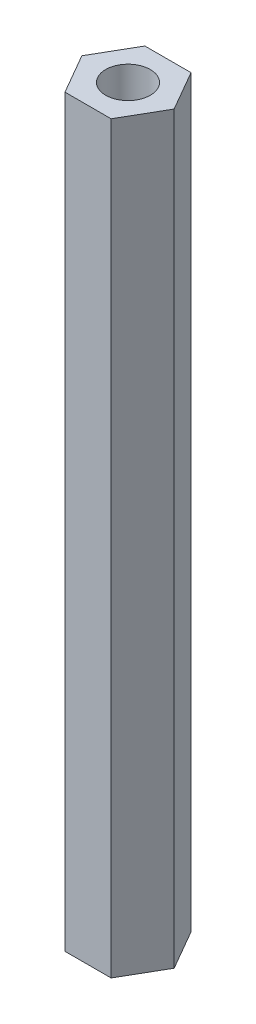
ISO-10303-21;
HEADER;
FILE_DESCRIPTION(('STEP AP214'),'2;1');
FILE_NAME('part.step','',(''),(''),'','','');
FILE_SCHEMA(('AUTOMOTIVE_DESIGN { 1 0 10303 214 1 1 1 1 }'));
ENDSEC;
DATA;
#1=APPLICATION_CONTEXT('core data for automotive mechanical design processes');
#2=APPLICATION_PROTOCOL_DEFINITION('international standard','automotive_design',2000,#1);
#3=PRODUCT_CONTEXT('',#1,'mechanical');
#4=PRODUCT('Part','Part','',(#3));
#5=PRODUCT_RELATED_PRODUCT_CATEGORY('part','',(#4));
#6=PRODUCT_DEFINITION_FORMATION('','',#4);
#7=PRODUCT_DEFINITION_CONTEXT('part definition',#1,'design');
#8=PRODUCT_DEFINITION('design','',#6,#7);
#9=PRODUCT_DEFINITION_SHAPE('','',#8);
#10=(LENGTH_UNIT() NAMED_UNIT(*) SI_UNIT(.MILLI.,.METRE.));
#11=(NAMED_UNIT(*) PLANE_ANGLE_UNIT() SI_UNIT($,.RADIAN.));
#12=(NAMED_UNIT(*) SI_UNIT($,.STERADIAN.) SOLID_ANGLE_UNIT());
#13=UNCERTAINTY_MEASURE_WITH_UNIT(LENGTH_MEASURE(1.E-05),#10,'distance_accuracy_value','');
#14=(GEOMETRIC_REPRESENTATION_CONTEXT(3) GLOBAL_UNCERTAINTY_ASSIGNED_CONTEXT((#13)) GLOBAL_UNIT_ASSIGNED_CONTEXT((#10,
#11,#12)) REPRESENTATION_CONTEXT('',''));
#15=CARTESIAN_POINT('',(0.,0.,0.));
#16=DIRECTION('',(0.,0.,1.));
#17=DIRECTION('',(1.,0.,0.));
#18=AXIS2_PLACEMENT_3D('',#15,#16,#17);
#19=CARTESIAN_POINT('',(1.55000000000003,50.,2.68467875173174));
#20=DIRECTION('',(-0.866025403784441,0.,-0.499999999999995));
#21=DIRECTION('',(-0.499999999999995,0.,0.866025403784441));
#22=AXIS2_PLACEMENT_3D('',#19,#20,#21);
#23=PLANE('',#22);
#24=DIRECTION('',(0.499999999999995,0.,-0.866025403784441));
#25=VECTOR('',#24,1.);
#26=CARTESIAN_POINT('',(1.55000000000003,0.,2.68467875173174));
#27=LINE('',#26,#25);
#28=CARTESIAN_POINT('',(1.55000000000003,0.,2.68467875173174));
#29=VERTEX_POINT('',#28);
#30=CARTESIAN_POINT('',(3.1,0.,0.));
#31=VERTEX_POINT('',#30);
#32=EDGE_CURVE('E139',#29,#31,#27,.T.);
#33=ORIENTED_EDGE('',*,*,#32,.T.);
#34=DIRECTION('',(0.,-1.,0.));
#35=VECTOR('',#34,1.);
#36=CARTESIAN_POINT('',(3.1,50.,0.));
#37=LINE('',#36,#35);
#38=CARTESIAN_POINT('',(3.1,50.,0.));
#39=VERTEX_POINT('',#38);
#40=EDGE_CURVE('E11',#39,#31,#37,.T.);
#41=ORIENTED_EDGE('',*,*,#40,.F.);
#42=DIRECTION('',(0.499999999999995,0.,-0.866025403784441));
#43=VECTOR('',#42,1.);
#44=CARTESIAN_POINT('',(1.55000000000003,50.,2.68467875173174));
#45=LINE('',#44,#43);
#46=CARTESIAN_POINT('',(1.55000000000003,50.,2.68467875173174));
#47=VERTEX_POINT('',#46);
#48=EDGE_CURVE('E156',#47,#39,#45,.T.);
#49=ORIENTED_EDGE('',*,*,#48,.F.);
#50=DIRECTION('',(0.,-1.,0.));
#51=VECTOR('',#50,1.);
#52=CARTESIAN_POINT('',(1.55000000000003,50.,2.68467875173174));
#53=LINE('',#52,#51);
#54=EDGE_CURVE('E135',#47,#29,#53,.T.);
#55=ORIENTED_EDGE('',*,*,#54,.T.);
#56=EDGE_LOOP('',(#33,#41,#49,#55));
#57=FACE_BOUND('',#56,.T.);
#58=ADVANCED_FACE('F49',(#57),#23,.F.);
#59=CARTESIAN_POINT('',(3.1,50.,0.));
#60=DIRECTION('',(-0.866025403784438,0.,0.500000000000001));
#61=DIRECTION('',(0.500000000000001,0.,0.866025403784438));
#62=AXIS2_PLACEMENT_3D('',#59,#60,#61);
#63=PLANE('',#62);
#64=DIRECTION('',(-0.500000000000001,0.,-0.866025403784438));
#65=VECTOR('',#64,1.);
#66=CARTESIAN_POINT('',(3.1,0.,0.));
#67=LINE('',#66,#65);
#68=CARTESIAN_POINT('',(1.54999999999999,0.,-2.68467875173176));
#69=VERTEX_POINT('',#68);
#70=EDGE_CURVE('E143',#31,#69,#67,.T.);
#71=ORIENTED_EDGE('',*,*,#70,.T.);
#72=DIRECTION('',(0.,-1.,0.));
#73=VECTOR('',#72,1.);
#74=CARTESIAN_POINT('',(1.54999999999999,50.,-2.68467875173176));
#75=LINE('',#74,#73);
#76=CARTESIAN_POINT('',(1.54999999999999,50.,-2.68467875173176));
#77=VERTEX_POINT('',#76);
#78=EDGE_CURVE('E58',#77,#69,#75,.T.);
#79=ORIENTED_EDGE('',*,*,#78,.F.);
#80=DIRECTION('',(-0.500000000000001,0.,-0.866025403784438));
#81=VECTOR('',#80,1.);
#82=CARTESIAN_POINT('',(3.1,50.,0.));
#83=LINE('',#82,#81);
#84=EDGE_CURVE('E103',#39,#77,#83,.T.);
#85=ORIENTED_EDGE('',*,*,#84,.F.);
#86=ORIENTED_EDGE('',*,*,#40,.T.);
#87=EDGE_LOOP('',(#71,#79,#85,#86));
#88=FACE_BOUND('',#87,.T.);
#89=ADVANCED_FACE('F186',(#88),#63,.F.);
#90=CARTESIAN_POINT('',(1.54999999999999,50.,-2.68467875173176));
#91=DIRECTION('',(0.,0.,1.));
#92=DIRECTION('',(1.,0.,0.));
#93=AXIS2_PLACEMENT_3D('',#90,#91,#92);
#94=PLANE('',#93);
#95=DIRECTION('',(-1.,0.,0.));
#96=VECTOR('',#95,1.);
#97=CARTESIAN_POINT('',(1.54999999999999,0.,-2.68467875173176));
#98=LINE('',#97,#96);
#99=CARTESIAN_POINT('',(-1.55000000000001,0.,-2.68467875173175));
#100=VERTEX_POINT('',#99);
#101=EDGE_CURVE('E147',#69,#100,#98,.T.);
#102=ORIENTED_EDGE('',*,*,#101,.T.);
#103=DIRECTION('',(0.,-1.,0.));
#104=VECTOR('',#103,1.);
#105=CARTESIAN_POINT('',(-1.55000000000001,50.,-2.68467875173175));
#106=LINE('',#105,#104);
#107=CARTESIAN_POINT('',(-1.55000000000001,50.,-2.68467875173175));
#108=VERTEX_POINT('',#107);
#109=EDGE_CURVE('E127',#108,#100,#106,.T.);
#110=ORIENTED_EDGE('',*,*,#109,.F.);
#111=DIRECTION('',(-1.,0.,0.));
#112=VECTOR('',#111,1.);
#113=CARTESIAN_POINT('',(1.54999999999999,50.,-2.68467875173176));
#114=LINE('',#113,#112);
#115=EDGE_CURVE('E116',#77,#108,#114,.T.);
#116=ORIENTED_EDGE('',*,*,#115,.F.);
#117=ORIENTED_EDGE('',*,*,#78,.T.);
#118=EDGE_LOOP('',(#102,#110,#116,#117));
#119=FACE_BOUND('',#118,.T.);
#120=ADVANCED_FACE('F167',(#119),#94,.F.);
#121=CARTESIAN_POINT('',(-1.55000000000001,50.,-2.68467875173175));
#122=DIRECTION('',(0.866025403784442,0.,0.499999999999995));
#123=DIRECTION('',(0.499999999999995,0.,-0.866025403784442));
#124=AXIS2_PLACEMENT_3D('',#121,#122,#123);
#125=PLANE('',#124);
#126=DIRECTION('',(-0.499999999999995,0.,0.866025403784442));
#127=VECTOR('',#126,1.);
#128=CARTESIAN_POINT('',(-1.55000000000001,0.,-2.68467875173175));
#129=LINE('',#128,#127);
#130=CARTESIAN_POINT('',(-3.1,0.,0.));
#131=VERTEX_POINT('',#130);
#132=EDGE_CURVE('E125',#100,#131,#129,.T.);
#133=ORIENTED_EDGE('',*,*,#132,.T.);
#134=DIRECTION('',(0.,-1.,0.));
#135=VECTOR('',#134,1.);
#136=CARTESIAN_POINT('',(-3.1,50.,0.));
#137=LINE('',#136,#135);
#138=CARTESIAN_POINT('',(-3.1,50.,0.));
#139=VERTEX_POINT('',#138);
#140=EDGE_CURVE('E122',#139,#131,#137,.T.);
#141=ORIENTED_EDGE('',*,*,#140,.F.);
#142=DIRECTION('',(-0.499999999999995,0.,0.866025403784442));
#143=VECTOR('',#142,1.);
#144=CARTESIAN_POINT('',(-1.55000000000001,50.,-2.68467875173175));
#145=LINE('',#144,#143);
#146=EDGE_CURVE('E110',#108,#139,#145,.T.);
#147=ORIENTED_EDGE('',*,*,#146,.F.);
#148=ORIENTED_EDGE('',*,*,#109,.T.);
#149=EDGE_LOOP('',(#133,#141,#147,#148));
#150=FACE_BOUND('',#149,.T.);
#151=ADVANCED_FACE('F123',(#150),#125,.F.);
#152=CARTESIAN_POINT('',(-3.1,50.,0.));
#153=DIRECTION('',(0.866025403784435,0.,-0.500000000000007));
#154=DIRECTION('',(-0.500000000000007,0.,-0.866025403784435));
#155=AXIS2_PLACEMENT_3D('',#152,#153,#154);
#156=PLANE('',#155);
#157=DIRECTION('',(0.500000000000007,0.,0.866025403784435));
#158=VECTOR('',#157,1.);
#159=CARTESIAN_POINT('',(-3.1,0.,0.));
#160=LINE('',#159,#158);
#161=CARTESIAN_POINT('',(-1.54999999999997,0.,2.68467875173177));
#162=VERTEX_POINT('',#161);
#163=EDGE_CURVE('E89',#131,#162,#160,.T.);
#164=ORIENTED_EDGE('',*,*,#163,.T.);
#165=DIRECTION('',(0.,-1.,0.));
#166=VECTOR('',#165,1.);
#167=CARTESIAN_POINT('',(-1.54999999999997,50.,2.68467875173177));
#168=LINE('',#167,#166);
#169=CARTESIAN_POINT('',(-1.54999999999997,50.,2.68467875173177));
#170=VERTEX_POINT('',#169);
#171=EDGE_CURVE('E128',#170,#162,#168,.T.);
#172=ORIENTED_EDGE('',*,*,#171,.F.);
#173=DIRECTION('',(0.500000000000007,0.,0.866025403784435));
#174=VECTOR('',#173,1.);
#175=CARTESIAN_POINT('',(-3.1,50.,0.));
#176=LINE('',#175,#174);
#177=EDGE_CURVE('E114',#139,#170,#176,.T.);
#178=ORIENTED_EDGE('',*,*,#177,.F.);
#179=ORIENTED_EDGE('',*,*,#140,.T.);
#180=EDGE_LOOP('',(#164,#172,#178,#179));
#181=FACE_BOUND('',#180,.T.);
#182=ADVANCED_FACE('F130',(#181),#156,.F.);
#183=CARTESIAN_POINT('',(-1.54999999999997,50.,2.68467875173177));
#184=DIRECTION('',(0.,0.,-1.));
#185=DIRECTION('',(-1.,0.,0.));
#186=AXIS2_PLACEMENT_3D('',#183,#184,#185);
#187=PLANE('',#186);
#188=DIRECTION('',(1.,0.,0.));
#189=VECTOR('',#188,1.);
#190=CARTESIAN_POINT('',(-1.54999999999997,0.,2.68467875173177));
#191=LINE('',#190,#189);
#192=EDGE_CURVE('E95',#162,#29,#191,.T.);
#193=ORIENTED_EDGE('',*,*,#192,.T.);
#194=ORIENTED_EDGE('',*,*,#54,.F.);
#195=DIRECTION('',(1.,0.,0.));
#196=VECTOR('',#195,1.);
#197=CARTESIAN_POINT('',(-1.54999999999997,50.,2.68467875173177));
#198=LINE('',#197,#196);
#199=EDGE_CURVE('E66',#170,#47,#198,.T.);
#200=ORIENTED_EDGE('',*,*,#199,.F.);
#201=ORIENTED_EDGE('',*,*,#171,.T.);
#202=EDGE_LOOP('',(#193,#194,#200,#201));
#203=FACE_BOUND('',#202,.T.);
#204=ADVANCED_FACE('F174',(#203),#187,.F.);
#205=CARTESIAN_POINT('',(0.,50.,0.));
#206=DIRECTION('',(0.,1.,0.));
#207=DIRECTION('',(0.,0.,1.));
#208=AXIS2_PLACEMENT_3D('',#205,#206,#207);
#209=PLANE('',#208);
#210=CARTESIAN_POINT('',(0.,50.,0.));
#211=DIRECTION('',(0.,1.,0.));
#212=DIRECTION('',(0.,0.,1.));
#213=AXIS2_PLACEMENT_3D('',#210,#211,#212);
#214=CIRCLE('',#213,1.5);
#215=CARTESIAN_POINT('',(0.,50.,1.5));
#216=VERTEX_POINT('',#215);
#217=EDGE_CURVE('E270',#216,#216,#214,.T.);
#218=ORIENTED_EDGE('',*,*,#217,.F.);
#219=EDGE_LOOP('',(#218));
#220=FACE_BOUND('',#219,.T.);
#221=ORIENTED_EDGE('',*,*,#48,.T.);
#222=ORIENTED_EDGE('',*,*,#84,.T.);
#223=ORIENTED_EDGE('',*,*,#115,.T.);
#224=ORIENTED_EDGE('',*,*,#146,.T.);
#225=ORIENTED_EDGE('',*,*,#177,.T.);
#226=ORIENTED_EDGE('',*,*,#199,.T.);
#227=EDGE_LOOP('',(#221,#222,#223,#224,#225,#226));
#228=FACE_BOUND('',#227,.T.);
#229=ADVANCED_FACE('F112',(#220,#228),#209,.T.);
#230=CARTESIAN_POINT('',(0.,0.,0.));
#231=DIRECTION('',(0.,1.,0.));
#232=DIRECTION('',(0.,0.,1.));
#233=AXIS2_PLACEMENT_3D('',#230,#231,#232);
#234=PLANE('',#233);
#235=CARTESIAN_POINT('',(0.,0.,0.));
#236=DIRECTION('',(0.,-1.,0.));
#237=DIRECTION('',(0.,0.,-1.));
#238=AXIS2_PLACEMENT_3D('',#235,#236,#237);
#239=CIRCLE('',#238,1.5);
#240=CARTESIAN_POINT('',(0.,0.,-1.5));
#241=VERTEX_POINT('',#240);
#242=EDGE_CURVE('E271',#241,#241,#239,.T.);
#243=ORIENTED_EDGE('',*,*,#242,.F.);
#244=EDGE_LOOP('',(#243));
#245=FACE_BOUND('',#244,.T.);
#246=ORIENTED_EDGE('',*,*,#32,.F.);
#247=ORIENTED_EDGE('',*,*,#192,.F.);
#248=ORIENTED_EDGE('',*,*,#163,.F.);
#249=ORIENTED_EDGE('',*,*,#132,.F.);
#250=ORIENTED_EDGE('',*,*,#101,.F.);
#251=ORIENTED_EDGE('',*,*,#70,.F.);
#252=EDGE_LOOP('',(#246,#247,#248,#249,#250,#251));
#253=FACE_BOUND('',#252,.T.);
#254=ADVANCED_FACE('F170',(#245,#253),#234,.F.);
#255=CARTESIAN_POINT('',(0.,40.,0.));
#256=DIRECTION('',(0.,1.,0.));
#257=DIRECTION('',(0.,0.,1.));
#258=AXIS2_PLACEMENT_3D('',#255,#256,#257);
#259=CYLINDRICAL_SURFACE('',#258,1.5);
#260=CARTESIAN_POINT('',(0.,40.,0.));
#261=DIRECTION('',(0.,1.,0.));
#262=DIRECTION('',(0.,0.,1.));
#263=AXIS2_PLACEMENT_3D('',#260,#261,#262);
#264=CIRCLE('',#263,1.5);
#265=CARTESIAN_POINT('',(0.,40.,1.5));
#266=VERTEX_POINT('',#265);
#267=EDGE_CURVE('E144',#266,#266,#264,.T.);
#268=ORIENTED_EDGE('',*,*,#267,.F.);
#269=EDGE_LOOP('',(#268));
#270=FACE_BOUND('',#269,.T.);
#271=ORIENTED_EDGE('',*,*,#217,.T.);
#272=EDGE_LOOP('',(#271));
#273=FACE_BOUND('',#272,.T.);
#274=ADVANCED_FACE('F222',(#270,#273),#259,.F.);
#275=CARTESIAN_POINT('',(0.,40.,0.));
#276=DIRECTION('',(0.,1.,0.));
#277=DIRECTION('',(0.,0.,1.));
#278=AXIS2_PLACEMENT_3D('',#275,#276,#277);
#279=PLANE('',#278);
#280=ORIENTED_EDGE('',*,*,#267,.T.);
#281=EDGE_LOOP('',(#280));
#282=FACE_BOUND('',#281,.T.);
#283=ADVANCED_FACE('F226',(#282),#279,.T.);
#284=CARTESIAN_POINT('',(0.,10.,0.));
#285=DIRECTION('',(0.,-1.,0.));
#286=DIRECTION('',(0.,0.,-1.));
#287=AXIS2_PLACEMENT_3D('',#284,#285,#286);
#288=CYLINDRICAL_SURFACE('',#287,1.5);
#289=CARTESIAN_POINT('',(0.,10.,0.));
#290=DIRECTION('',(0.,-1.,0.));
#291=DIRECTION('',(0.,0.,-1.));
#292=AXIS2_PLACEMENT_3D('',#289,#290,#291);
#293=CIRCLE('',#292,1.5);
#294=CARTESIAN_POINT('',(0.,10.,-1.5));
#295=VERTEX_POINT('',#294);
#296=EDGE_CURVE('E268',#295,#295,#293,.T.);
#297=ORIENTED_EDGE('',*,*,#296,.F.);
#298=EDGE_LOOP('',(#297));
#299=FACE_BOUND('',#298,.T.);
#300=ORIENTED_EDGE('',*,*,#242,.T.);
#301=EDGE_LOOP('',(#300));
#302=FACE_BOUND('',#301,.T.);
#303=ADVANCED_FACE('F235',(#299,#302),#288,.F.);
#304=CARTESIAN_POINT('',(0.,10.,0.));
#305=DIRECTION('',(0.,-1.,0.));
#306=DIRECTION('',(0.,0.,-1.));
#307=AXIS2_PLACEMENT_3D('',#304,#305,#306);
#308=PLANE('',#307);
#309=ORIENTED_EDGE('',*,*,#296,.T.);
#310=EDGE_LOOP('',(#309));
#311=FACE_BOUND('',#310,.T.);
#312=ADVANCED_FACE('F250',(#311),#308,.T.);
#313=CLOSED_SHELL('',(#58,#89,#120,#151,#182,#204,#229,#254,#274,#283,#303,#312));
#314=MANIFOLD_SOLID_BREP('B2',#313);
#315=ADVANCED_BREP_SHAPE_REPRESENTATION('',(#18,#314),#14);
#316=SHAPE_DEFINITION_REPRESENTATION(#9,#315);
ENDSEC;
END-ISO-10303-21;
